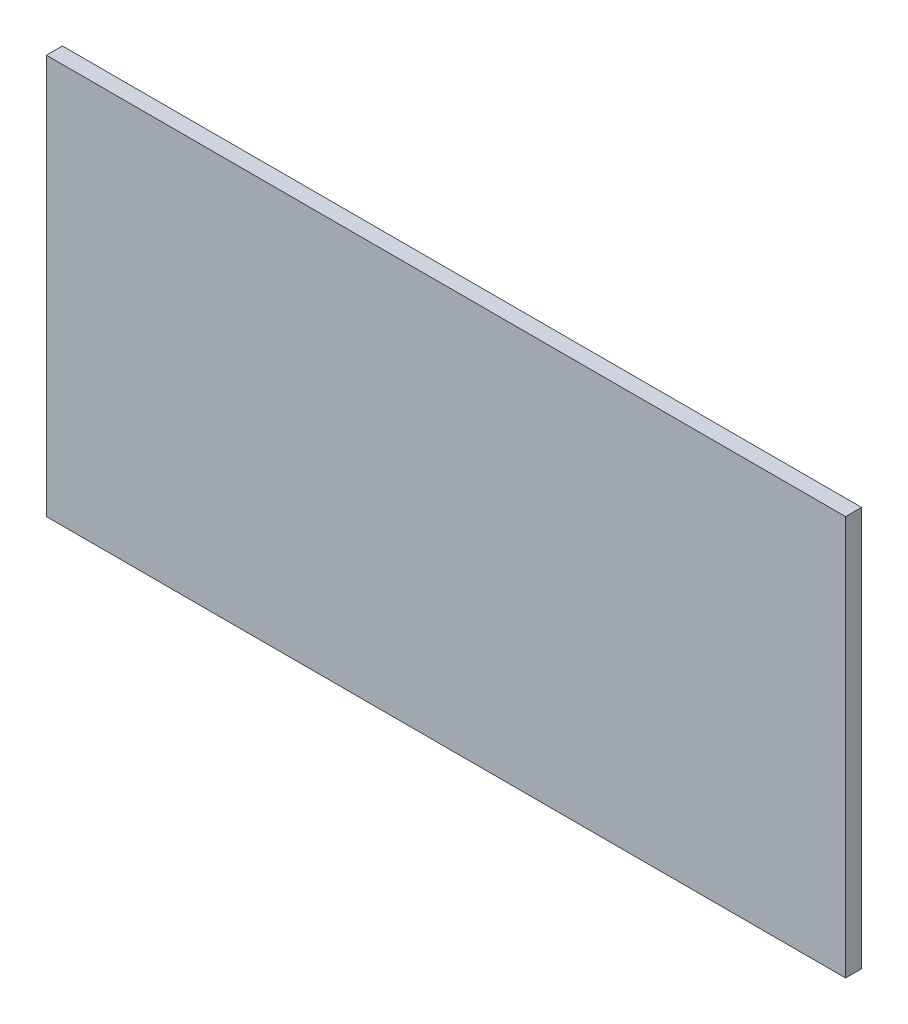
ISO-10303-21;
HEADER;
FILE_DESCRIPTION(('STEP AP214'),'2;1');
FILE_NAME('part.step','',(''),(''),'','','');
FILE_SCHEMA(('AUTOMOTIVE_DESIGN { 1 0 10303 214 1 1 1 1 }'));
ENDSEC;
DATA;
#1=APPLICATION_CONTEXT('core data for automotive mechanical design processes');
#2=APPLICATION_PROTOCOL_DEFINITION('international standard','automotive_design',2000,#1);
#3=PRODUCT_CONTEXT('',#1,'mechanical');
#4=PRODUCT('Part','Part','',(#3));
#5=PRODUCT_RELATED_PRODUCT_CATEGORY('part','',(#4));
#6=PRODUCT_DEFINITION_FORMATION('','',#4);
#7=PRODUCT_DEFINITION_CONTEXT('part definition',#1,'design');
#8=PRODUCT_DEFINITION('design','',#6,#7);
#9=PRODUCT_DEFINITION_SHAPE('','',#8);
#10=(LENGTH_UNIT() NAMED_UNIT(*) SI_UNIT(.MILLI.,.METRE.));
#11=(NAMED_UNIT(*) PLANE_ANGLE_UNIT() SI_UNIT($,.RADIAN.));
#12=(NAMED_UNIT(*) SI_UNIT($,.STERADIAN.) SOLID_ANGLE_UNIT());
#13=UNCERTAINTY_MEASURE_WITH_UNIT(LENGTH_MEASURE(1.E-05),#10,'distance_accuracy_value','');
#14=(GEOMETRIC_REPRESENTATION_CONTEXT(3) GLOBAL_UNCERTAINTY_ASSIGNED_CONTEXT((#13)) GLOBAL_UNIT_ASSIGNED_CONTEXT((#10,
#11,#12)) REPRESENTATION_CONTEXT('',''));
#15=CARTESIAN_POINT('',(0.,0.,0.));
#16=DIRECTION('',(0.,0.,1.));
#17=DIRECTION('',(1.,0.,0.));
#18=AXIS2_PLACEMENT_3D('',#15,#16,#17);
#19=CARTESIAN_POINT('',(50.,-25.,-2.));
#20=DIRECTION('',(1.,0.,0.));
#21=DIRECTION('',(0.,0.,-1.));
#22=AXIS2_PLACEMENT_3D('',#19,#20,#21);
#23=PLANE('',#22);
#24=DIRECTION('',(0.,1.,0.));
#25=VECTOR('',#24,1.);
#26=CARTESIAN_POINT('',(50.,-25.,0.));
#27=LINE('',#26,#25);
#28=CARTESIAN_POINT('',(50.,-25.,0.));
#29=VERTEX_POINT('',#28);
#30=CARTESIAN_POINT('',(50.,25.,0.));
#31=VERTEX_POINT('',#30);
#32=EDGE_CURVE('E105',#29,#31,#27,.T.);
#33=ORIENTED_EDGE('',*,*,#32,.F.);
#34=DIRECTION('',(0.,0.,1.));
#35=VECTOR('',#34,1.);
#36=CARTESIAN_POINT('',(50.,-25.,-2.));
#37=LINE('',#36,#35);
#38=CARTESIAN_POINT('',(50.,-25.,-2.));
#39=VERTEX_POINT('',#38);
#40=EDGE_CURVE('E11',#39,#29,#37,.T.);
#41=ORIENTED_EDGE('',*,*,#40,.F.);
#42=DIRECTION('',(0.,1.,0.));
#43=VECTOR('',#42,1.);
#44=CARTESIAN_POINT('',(50.,-25.,-2.));
#45=LINE('',#44,#43);
#46=CARTESIAN_POINT('',(50.,25.,-2.));
#47=VERTEX_POINT('',#46);
#48=EDGE_CURVE('E99',#39,#47,#45,.T.);
#49=ORIENTED_EDGE('',*,*,#48,.T.);
#50=DIRECTION('',(0.,0.,1.));
#51=VECTOR('',#50,1.);
#52=CARTESIAN_POINT('',(50.,25.,-2.));
#53=LINE('',#52,#51);
#54=EDGE_CURVE('E44',#47,#31,#53,.T.);
#55=ORIENTED_EDGE('',*,*,#54,.T.);
#56=EDGE_LOOP('',(#33,#41,#49,#55));
#57=FACE_BOUND('',#56,.T.);
#58=ADVANCED_FACE('F41',(#57),#23,.T.);
#59=CARTESIAN_POINT('',(-50.,-25.,-2.));
#60=DIRECTION('',(0.,-1.,0.));
#61=DIRECTION('',(0.,0.,-1.));
#62=AXIS2_PLACEMENT_3D('',#59,#60,#61);
#63=PLANE('',#62);
#64=DIRECTION('',(1.,0.,0.));
#65=VECTOR('',#64,1.);
#66=CARTESIAN_POINT('',(-50.,-25.,0.));
#67=LINE('',#66,#65);
#68=CARTESIAN_POINT('',(-50.,-25.,0.));
#69=VERTEX_POINT('',#68);
#70=EDGE_CURVE('E101',#69,#29,#67,.T.);
#71=ORIENTED_EDGE('',*,*,#70,.F.);
#72=DIRECTION('',(0.,0.,1.));
#73=VECTOR('',#72,1.);
#74=CARTESIAN_POINT('',(-50.,-25.,-2.));
#75=LINE('',#74,#73);
#76=CARTESIAN_POINT('',(-50.,-25.,-2.));
#77=VERTEX_POINT('',#76);
#78=EDGE_CURVE('E50',#77,#69,#75,.T.);
#79=ORIENTED_EDGE('',*,*,#78,.F.);
#80=DIRECTION('',(1.,0.,0.));
#81=VECTOR('',#80,1.);
#82=CARTESIAN_POINT('',(-50.,-25.,-2.));
#83=LINE('',#82,#81);
#84=EDGE_CURVE('E96',#77,#39,#83,.T.);
#85=ORIENTED_EDGE('',*,*,#84,.T.);
#86=ORIENTED_EDGE('',*,*,#40,.T.);
#87=EDGE_LOOP('',(#71,#79,#85,#86));
#88=FACE_BOUND('',#87,.T.);
#89=ADVANCED_FACE('F115',(#88),#63,.T.);
#90=CARTESIAN_POINT('',(-50.,-25.,-2.));
#91=DIRECTION('',(-1.,0.,0.));
#92=DIRECTION('',(0.,0.,1.));
#93=AXIS2_PLACEMENT_3D('',#90,#91,#92);
#94=PLANE('',#93);
#95=DIRECTION('',(0.,-1.,0.));
#96=VECTOR('',#95,1.);
#97=CARTESIAN_POINT('',(-50.,-25.,0.));
#98=LINE('',#97,#96);
#99=CARTESIAN_POINT('',(-50.,25.,0.));
#100=VERTEX_POINT('',#99);
#101=EDGE_CURVE('E91',#100,#69,#98,.T.);
#102=ORIENTED_EDGE('',*,*,#101,.F.);
#103=DIRECTION('',(0.,0.,1.));
#104=VECTOR('',#103,1.);
#105=CARTESIAN_POINT('',(-50.,25.,-2.));
#106=LINE('',#105,#104);
#107=CARTESIAN_POINT('',(-50.,25.,-2.));
#108=VERTEX_POINT('',#107);
#109=EDGE_CURVE('E86',#108,#100,#106,.T.);
#110=ORIENTED_EDGE('',*,*,#109,.F.);
#111=DIRECTION('',(0.,-1.,0.));
#112=VECTOR('',#111,1.);
#113=CARTESIAN_POINT('',(-50.,-25.,-2.));
#114=LINE('',#113,#112);
#115=EDGE_CURVE('E89',#108,#77,#114,.T.);
#116=ORIENTED_EDGE('',*,*,#115,.T.);
#117=ORIENTED_EDGE('',*,*,#78,.T.);
#118=EDGE_LOOP('',(#102,#110,#116,#117));
#119=FACE_BOUND('',#118,.T.);
#120=ADVANCED_FACE('F88',(#119),#94,.T.);
#121=CARTESIAN_POINT('',(-50.,25.,-2.));
#122=DIRECTION('',(0.,1.,0.));
#123=DIRECTION('',(0.,0.,1.));
#124=AXIS2_PLACEMENT_3D('',#121,#122,#123);
#125=PLANE('',#124);
#126=DIRECTION('',(-1.,0.,0.));
#127=VECTOR('',#126,1.);
#128=CARTESIAN_POINT('',(-50.,25.,0.));
#129=LINE('',#128,#127);
#130=EDGE_CURVE('E108',#31,#100,#129,.T.);
#131=ORIENTED_EDGE('',*,*,#130,.F.);
#132=ORIENTED_EDGE('',*,*,#54,.F.);
#133=DIRECTION('',(-1.,0.,0.));
#134=VECTOR('',#133,1.);
#135=CARTESIAN_POINT('',(-50.,25.,-2.));
#136=LINE('',#135,#134);
#137=EDGE_CURVE('E95',#47,#108,#136,.T.);
#138=ORIENTED_EDGE('',*,*,#137,.T.);
#139=ORIENTED_EDGE('',*,*,#109,.T.);
#140=EDGE_LOOP('',(#131,#132,#138,#139));
#141=FACE_BOUND('',#140,.T.);
#142=ADVANCED_FACE('F98',(#141),#125,.T.);
#143=CARTESIAN_POINT('',(0.,0.,-2.));
#144=DIRECTION('',(0.,0.,-1.));
#145=DIRECTION('',(-1.,0.,0.));
#146=AXIS2_PLACEMENT_3D('',#143,#144,#145);
#147=PLANE('',#146);
#148=ORIENTED_EDGE('',*,*,#48,.F.);
#149=ORIENTED_EDGE('',*,*,#84,.F.);
#150=ORIENTED_EDGE('',*,*,#115,.F.);
#151=ORIENTED_EDGE('',*,*,#137,.F.);
#152=EDGE_LOOP('',(#148,#149,#150,#151));
#153=FACE_BOUND('',#152,.T.);
#154=ADVANCED_FACE('F94',(#153),#147,.T.);
#155=CARTESIAN_POINT('',(0.,0.,0.));
#156=DIRECTION('',(0.,0.,-1.));
#157=DIRECTION('',(-1.,0.,0.));
#158=AXIS2_PLACEMENT_3D('',#155,#156,#157);
#159=PLANE('',#158);
#160=ORIENTED_EDGE('',*,*,#32,.T.);
#161=ORIENTED_EDGE('',*,*,#130,.T.);
#162=ORIENTED_EDGE('',*,*,#101,.T.);
#163=ORIENTED_EDGE('',*,*,#70,.T.);
#164=EDGE_LOOP('',(#160,#161,#162,#163));
#165=FACE_BOUND('',#164,.T.);
#166=ADVANCED_FACE('F114',(#165),#159,.F.);
#167=CLOSED_SHELL('',(#58,#89,#120,#142,#154,#166));
#168=MANIFOLD_SOLID_BREP('B2',#167);
#169=ADVANCED_BREP_SHAPE_REPRESENTATION('',(#18,#168),#14);
#170=SHAPE_DEFINITION_REPRESENTATION(#9,#169);
ENDSEC;
END-ISO-10303-21;
